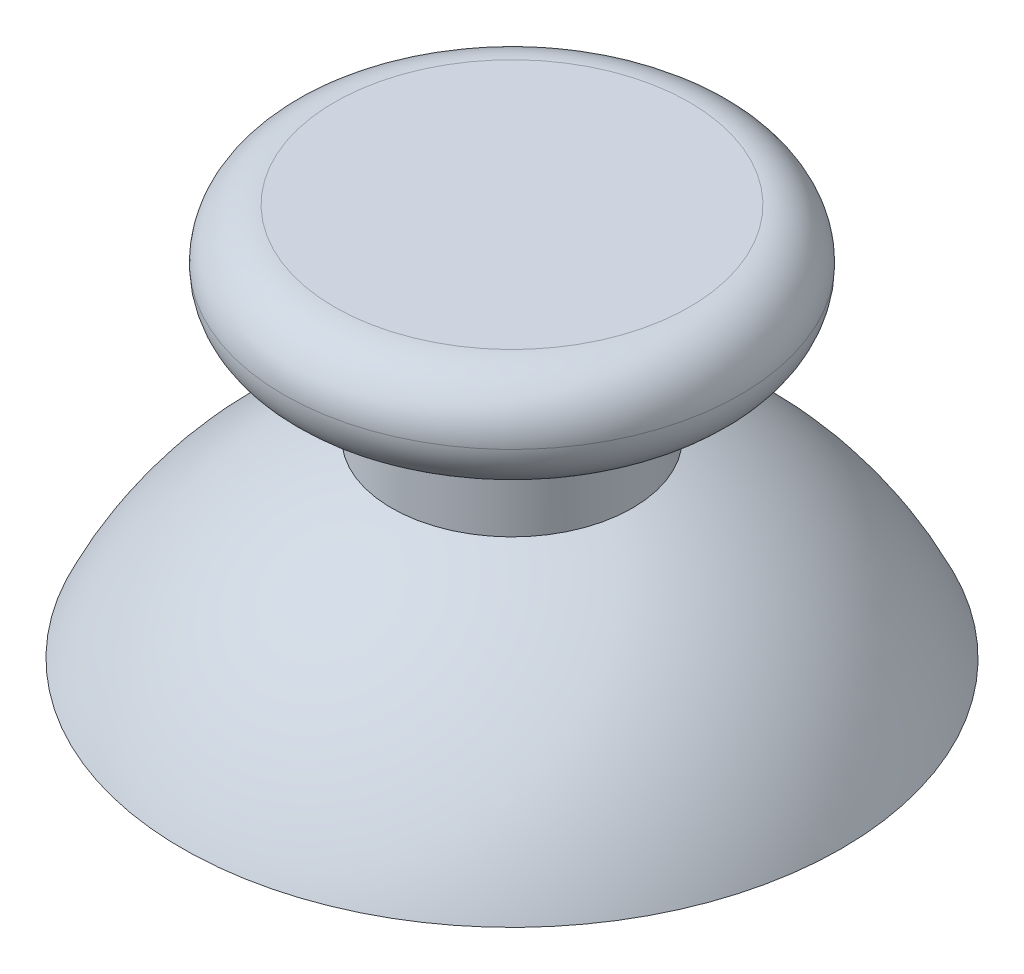
ISO-10303-21;
HEADER;
FILE_DESCRIPTION(('STEP AP214'),'2;1');
FILE_NAME('part.step','',(''),(''),'','','');
FILE_SCHEMA(('AUTOMOTIVE_DESIGN { 1 0 10303 214 1 1 1 1 }'));
ENDSEC;
DATA;
#1=APPLICATION_CONTEXT('core data for automotive mechanical design processes');
#2=APPLICATION_PROTOCOL_DEFINITION('international standard','automotive_design',2000,#1);
#3=PRODUCT_CONTEXT('',#1,'mechanical');
#4=PRODUCT('Part','Part','',(#3));
#5=PRODUCT_RELATED_PRODUCT_CATEGORY('part','',(#4));
#6=PRODUCT_DEFINITION_FORMATION('','',#4);
#7=PRODUCT_DEFINITION_CONTEXT('part definition',#1,'design');
#8=PRODUCT_DEFINITION('design','',#6,#7);
#9=PRODUCT_DEFINITION_SHAPE('','',#8);
#10=(LENGTH_UNIT() NAMED_UNIT(*) SI_UNIT(.MILLI.,.METRE.));
#11=(NAMED_UNIT(*) PLANE_ANGLE_UNIT() SI_UNIT($,.RADIAN.));
#12=(NAMED_UNIT(*) SI_UNIT($,.STERADIAN.) SOLID_ANGLE_UNIT());
#13=UNCERTAINTY_MEASURE_WITH_UNIT(LENGTH_MEASURE(1.E-05),#10,'distance_accuracy_value','');
#14=(GEOMETRIC_REPRESENTATION_CONTEXT(3) GLOBAL_UNCERTAINTY_ASSIGNED_CONTEXT((#13)) GLOBAL_UNIT_ASSIGNED_CONTEXT((#10,
#11,#12)) REPRESENTATION_CONTEXT('',''));
#15=CARTESIAN_POINT('',(0.,0.,0.));
#16=DIRECTION('',(0.,0.,1.));
#17=DIRECTION('',(1.,0.,0.));
#18=AXIS2_PLACEMENT_3D('',#15,#16,#17);
#19=CARTESIAN_POINT('',(0.,4.,0.));
#20=DIRECTION('',(0.,-1.,0.));
#21=DIRECTION('',(0.,0.,-1.));
#22=AXIS2_PLACEMENT_3D('',#19,#20,#21);
#23=CYLINDRICAL_SURFACE('',#22,4.75);
#24=CARTESIAN_POINT('',(0.,0.00694265924009937,0.));
#25=DIRECTION('',(0.,-1.,0.));
#26=DIRECTION('',(0.,0.,-1.));
#27=AXIS2_PLACEMENT_3D('',#24,#25,#26);
#28=CIRCLE('',#27,4.75);
#29=CARTESIAN_POINT('',(4.75,0.00694265924010111,0.));
#30=VERTEX_POINT('',#29);
#31=EDGE_CURVE('E55',#30,#30,#28,.F.);
#32=ORIENTED_EDGE('',*,*,#31,.T.);
#33=EDGE_LOOP('',(#32));
#34=FACE_BOUND('',#33,.T.);
#35=CARTESIAN_POINT('',(0.,4.,0.));
#36=DIRECTION('',(0.,1.,0.));
#37=DIRECTION('',(0.,0.,1.));
#38=AXIS2_PLACEMENT_3D('',#35,#36,#37);
#39=CIRCLE('',#38,4.75);
#40=CARTESIAN_POINT('',(0.,4.,4.75));
#41=VERTEX_POINT('',#40);
#42=EDGE_CURVE('E49',#41,#41,#39,.T.);
#43=ORIENTED_EDGE('',*,*,#42,.F.);
#44=EDGE_LOOP('',(#43));
#45=FACE_BOUND('',#44,.T.);
#46=ADVANCED_FACE('F32',(#34,#45),#23,.T.);
#47=CARTESIAN_POINT('',(0.,8.,0.));
#48=DIRECTION('',(0.,1.,0.));
#49=DIRECTION('',(0.,0.,1.));
#50=AXIS2_PLACEMENT_3D('',#47,#48,#49);
#51=PLANE('',#50);
#52=CARTESIAN_POINT('',(0.,8.,0.));
#53=DIRECTION('',(0.,1.,0.));
#54=DIRECTION('',(0.,0.,1.));
#55=AXIS2_PLACEMENT_3D('',#52,#53,#54);
#56=CIRCLE('',#55,7.);
#57=CARTESIAN_POINT('',(0.,8.,7.));
#58=VERTEX_POINT('',#57);
#59=EDGE_CURVE('E44',#58,#58,#56,.T.);
#60=ORIENTED_EDGE('',*,*,#59,.T.);
#61=EDGE_LOOP('',(#60));
#62=FACE_BOUND('',#61,.T.);
#63=ADVANCED_FACE('F77',(#62),#51,.T.);
#64=CARTESIAN_POINT('',(0.,4.,0.));
#65=DIRECTION('',(0.,1.,0.));
#66=DIRECTION('',(0.,0.,1.));
#67=AXIS2_PLACEMENT_3D('',#64,#65,#66);
#68=PLANE('',#67);
#69=CARTESIAN_POINT('',(0.,4.,0.));
#70=DIRECTION('',(0.,1.,0.));
#71=DIRECTION('',(0.,0.,1.));
#72=AXIS2_PLACEMENT_3D('',#69,#70,#71);
#73=CIRCLE('',#72,7.);
#74=CARTESIAN_POINT('',(0.,4.,7.));
#75=VERTEX_POINT('',#74);
#76=EDGE_CURVE('E40',#75,#75,#73,.F.);
#77=ORIENTED_EDGE('',*,*,#76,.T.);
#78=EDGE_LOOP('',(#77));
#79=FACE_BOUND('',#78,.T.);
#80=ORIENTED_EDGE('',*,*,#42,.T.);
#81=EDGE_LOOP('',(#80));
#82=FACE_BOUND('',#81,.T.);
#83=ADVANCED_FACE('F74',(#79,#82),#68,.F.);
#84=CARTESIAN_POINT('',(0.,6.,0.));
#85=DIRECTION('',(0.,1.,0.));
#86=DIRECTION('',(0.,0.,1.));
#87=AXIS2_PLACEMENT_3D('',#84,#85,#86);
#88=TOROIDAL_SURFACE('',#87,7.,2.);
#89=ORIENTED_EDGE('',*,*,#76,.F.);
#90=EDGE_LOOP('',(#89));
#91=FACE_BOUND('',#90,.T.);
#92=CARTESIAN_POINT('',(0.,6.,0.));
#93=DIRECTION('',(0.,1.,0.));
#94=DIRECTION('',(0.,0.,1.));
#95=AXIS2_PLACEMENT_3D('',#92,#93,#94);
#96=CIRCLE('',#95,9.);
#97=CARTESIAN_POINT('',(0.,6.,9.));
#98=VERTEX_POINT('',#97);
#99=EDGE_CURVE('E53',#98,#98,#96,.T.);
#100=ORIENTED_EDGE('',*,*,#99,.F.);
#101=EDGE_LOOP('',(#100));
#102=FACE_BOUND('',#101,.T.);
#103=ADVANCED_FACE('F34',(#91,#102),#88,.T.);
#104=CARTESIAN_POINT('',(0.,6.,0.));
#105=DIRECTION('',(0.,1.,0.));
#106=DIRECTION('',(0.,0.,1.));
#107=AXIS2_PLACEMENT_3D('',#104,#105,#106);
#108=TOROIDAL_SURFACE('',#107,7.,2.);
#109=ORIENTED_EDGE('',*,*,#99,.T.);
#110=EDGE_LOOP('',(#109));
#111=FACE_BOUND('',#110,.T.);
#112=ORIENTED_EDGE('',*,*,#59,.F.);
#113=EDGE_LOOP('',(#112));
#114=FACE_BOUND('',#113,.T.);
#115=ADVANCED_FACE('F85',(#111,#114),#108,.T.);
#116=CARTESIAN_POINT('',(0.,-13.5,0.));
#117=DIRECTION('',(0.,-1.,0.));
#118=DIRECTION('',(1.,0.,0.));
#119=AXIS2_PLACEMENT_3D('',#116,#117,#118);
#120=SPHERICAL_SURFACE('',#119,14.3178210632764);
#121=CARTESIAN_POINT('',(0.,-7.5,0.));
#122=DIRECTION('',(0.,-1.,0.));
#123=DIRECTION('',(0.,0.,-1.));
#124=AXIS2_PLACEMENT_3D('',#121,#122,#123);
#125=CIRCLE('',#124,13.);
#126=CARTESIAN_POINT('',(13.,-7.5,0.));
#127=VERTEX_POINT('',#126);
#128=EDGE_CURVE('E57',#127,#127,#125,.T.);
#129=CARTESIAN_POINT('',(13.,-7.5,0.));
#130=CARTESIAN_POINT('',(12.9499861839836,-7.39163593249533,0.));
#131=CARTESIAN_POINT('',(12.8986168451345,-7.2838975068988,0.));
#132=CARTESIAN_POINT('',(12.7932005645917,-7.06973866054883,0.));
#133=CARTESIAN_POINT('',(12.7391536228979,-6.96331823979541,0.));
#134=CARTESIAN_POINT('',(12.6284155794858,-6.75186212415852,0.));
#135=CARTESIAN_POINT('',(12.5717244777676,-6.64682642927507,0.));
#136=CARTESIAN_POINT('',(12.4557336592176,-6.43820539967056,0.));
#137=CARTESIAN_POINT('',(12.3964339423858,-6.33462006494951,0.));
#138=CARTESIAN_POINT('',(12.2752629495261,-6.12896454219563,0.));
#139=CARTESIAN_POINT('',(12.2133916734982,-6.02689435416279,0.));
#140=CARTESIAN_POINT('',(12.0871162584232,-5.82433294800363,0.));
#141=CARTESIAN_POINT('',(12.0227121193761,-5.7238417298773,0.));
#142=CARTESIAN_POINT('',(11.8914112496597,-5.52450110363583,0.));
#143=CARTESIAN_POINT('',(11.8245145189903,-5.42565169552068,0.));
#144=CARTESIAN_POINT('',(11.6882702984072,-5.22965650161063,0.));
#145=CARTESIAN_POINT('',(11.6189228084934,-5.13251071581572,0.));
#146=CARTESIAN_POINT('',(11.4778204336893,-4.93998351385043,0.));
#147=CARTESIAN_POINT('',(11.4060655487991,-4.84460209768006,0.));
#148=CARTESIAN_POINT('',(11.2601932538691,-4.65566327889016,0.));
#149=CARTESIAN_POINT('',(11.1860758438294,-4.56210587627063,0.));
#150=CARTESIAN_POINT('',(11.0355248457184,-4.37687358793774,0.));
#151=CARTESIAN_POINT('',(10.959091257647,-4.28519870222438,0.));
#152=CARTESIAN_POINT('',(10.8039556989557,-4.10378877387714,0.));
#153=CARTESIAN_POINT('',(10.7252537283356,-4.01405373124325,0.));
#154=CARTESIAN_POINT('',(10.5656306184925,-3.83657960220637,0.));
#155=CARTESIAN_POINT('',(10.4847094792694,-3.74884051580339,0.));
#156=CARTESIAN_POINT('',(10.320698633858,-3.57541316426723,0.));
#157=CARTESIAN_POINT('',(10.2376089276697,-3.48972489913407,0.));
#158=CARTESIAN_POINT('',(10.0693129060146,-3.32045277275623,0.));
#159=CARTESIAN_POINT('',(9.98410659054782,-3.23686891151156,0.));
#160=CARTESIAN_POINT('',(9.81163063158152,-3.07185785960272,0.));
#161=CARTESIAN_POINT('',(9.724360988082,-2.99043066893856,0.));
#162=CARTESIAN_POINT('',(9.54781294453699,-2.82978387627269,0.));
#163=CARTESIAN_POINT('',(9.45853454449149,-2.75056427427098,0.));
#164=CARTESIAN_POINT('',(9.27802481545774,-2.59438219656178,0.));
#165=CARTESIAN_POINT('',(9.18679348646947,-2.51741972085428,0.));
#166=CARTESIAN_POINT('',(9.00243494835963,-2.3658000219382,0.));
#167=CARTESIAN_POINT('',(8.90930773923805,-2.29114279872961,0.));
#168=CARTESIAN_POINT('',(8.72121567520355,-2.14418028949461,0.));
#169=CARTESIAN_POINT('',(8.62625082029062,-2.0718750034682,0.));
#170=CARTESIAN_POINT('',(8.43454284813268,-1.92966158256679,0.));
#171=CARTESIAN_POINT('',(8.33779973088767,-1.85975344769179,0.));
#172=CARTESIAN_POINT('',(8.14259572950881,-1.72237804407409,0.));
#173=CARTESIAN_POINT('',(8.04413484537497,-1.65491077533139,0.));
#174=CARTESIAN_POINT('',(7.8455568798151,-1.52245929263914,0.));
#175=CARTESIAN_POINT('',(7.74543979838909,-1.4574750786896,0.));
#176=CARTESIAN_POINT('',(7.54361204350017,-1.33003034152736,0.));
#177=CARTESIAN_POINT('',(7.44190137003726,-1.26756981831465,0.));
#178=CARTESIAN_POINT('',(7.23695003281783,-1.14521152050085,0.));
#179=CARTESIAN_POINT('',(7.13370936906131,-1.08531374589976,0.));
#180=CARTESIAN_POINT('',(6.92576260979774,-0.968118400472015,0.));
#181=CARTESIAN_POINT('',(6.82105651429071,-0.910820829645367,0.));
#182=CARTESIAN_POINT('',(6.61024436618822,-0.79886172161457,0.));
#183=CARTESIAN_POINT('',(6.50413831359278,-0.744200184410421,0.));
#184=CARTESIAN_POINT('',(6.29059260231296,-0.6375473226976,0.));
#185=CARTESIAN_POINT('',(6.18315294362858,-0.585555998188927,0.));
#186=CARTESIAN_POINT('',(5.9670072016841,-0.484276080194068,0.));
#187=CARTESIAN_POINT('',(5.85830111842398,-0.434987486707881,0.));
#188=CARTESIAN_POINT('',(5.63969051351607,-0.339143825451928,0.));
#189=CARTESIAN_POINT('',(5.52978599186828,-0.292588757682161,0.));
#190=CARTESIAN_POINT('',(5.30884719818328,-0.202241358472295,0.));
#191=CARTESIAN_POINT('',(5.19781292614608,-0.158449027032196,0.));
#192=CARTESIAN_POINT('',(4.97468420377368,-0.0736541160652312,0.));
#193=CARTESIAN_POINT('',(4.86258975343848,-0.0326515365383655,0.));
#194=CARTESIAN_POINT('',(4.75,0.00694265924010111,0.));
#195=B_SPLINE_CURVE_WITH_KNOTS('',3,(#129,#130,#131,#132,#133,#134,#135,#136,#137,#138,#139,
#140,#141,#142,#143,#144,#145,#146,#147,#148,#149,#150,#151,#152,#153,#154,#155,#156,#157,#158,
#159,#160,#161,#162,#163,#164,#165,#166,#167,#168,#169,#170,#171,#172,#173,#174,#175,#176,#177,
#178,#179,#180,#181,#182,#183,#184,#185,#186,#187,#188,#189,#190,#191,#192,#193,#194),
.UNSPECIFIED.,.F.,.F.,(4,2,2,2,2,2,2,2,2,2,2,2,2,2,2,2,2,2,2,2,2,2,2,2,2,2,2,2,2,2,2,2,4),(0.,
0.358037258179801,0.716074516359602,1.0741117745394,1.4321490327192,1.79018629089901,
2.1482235490788,2.50626080725861,2.86429806543841,3.22233532361821,3.58037258179801,
3.93840983997781,4.29644709815761,4.65448435633741,5.01252161451721,5.37055887269702,
5.72859613087682,6.08663338905662,6.44467064723642,6.80270790541622,7.16074516359602,
7.51878242177582,7.87681967995562,8.23485693813542,8.59289419631522,8.95093145449502,
9.30896871267482,9.66700597085462,10.0250432290344,10.3830804872142,10.741117745394,
11.0991550035738,11.4571922617536),.UNSPECIFIED.);
#196=EDGE_CURVE('BSEAM87',#127,#30,#195,.T.);
#197=ORIENTED_EDGE('',*,*,#128,.F.);
#198=ORIENTED_EDGE('',*,*,#31,.F.);
#199=ORIENTED_EDGE('',*,*,#196,.T.);
#200=ORIENTED_EDGE('',*,*,#196,.F.);
#201=EDGE_LOOP('',(#197,#199,#198,#200));
#202=FACE_BOUND('',#201,.T.);
#203=ADVANCED_FACE('F87',(#202),#120,.T.);
#204=CARTESIAN_POINT('',(13.,-7.5,0.));
#205=DIRECTION('',(0.,1.,0.));
#206=DIRECTION('',(0.,0.,1.));
#207=AXIS2_PLACEMENT_3D('',#204,#205,#206);
#208=PLANE('',#207);
#209=CARTESIAN_POINT('',(0.,-7.5,0.));
#210=DIRECTION('',(0.,1.,0.));
#211=DIRECTION('',(0.,0.,1.));
#212=AXIS2_PLACEMENT_3D('',#209,#210,#211);
#213=CIRCLE('',#212,11.8896744225167);
#214=CARTESIAN_POINT('',(11.8896744225167,-7.5,0.));
#215=VERTEX_POINT('',#214);
#216=EDGE_CURVE('E69',#215,#215,#213,.F.);
#217=ORIENTED_EDGE('',*,*,#216,.F.);
#218=EDGE_LOOP('',(#217));
#219=FACE_BOUND('',#218,.T.);
#220=ORIENTED_EDGE('',*,*,#128,.T.);
#221=EDGE_LOOP('',(#220));
#222=FACE_BOUND('',#221,.T.);
#223=ADVANCED_FACE('F93',(#219,#222),#208,.F.);
#224=CARTESIAN_POINT('',(0.,4.,0.));
#225=DIRECTION('',(0.,-1.,0.));
#226=DIRECTION('',(0.,0.,-1.));
#227=AXIS2_PLACEMENT_3D('',#224,#225,#226);
#228=CYLINDRICAL_SURFACE('',#227,3.75);
#229=CARTESIAN_POINT('',(0.,0.,0.));
#230=DIRECTION('',(0.,-1.,0.));
#231=DIRECTION('',(0.,0.,-1.));
#232=AXIS2_PLACEMENT_3D('',#229,#230,#231);
#233=CIRCLE('',#232,3.75);
#234=CARTESIAN_POINT('',(0.,0.,-3.75));
#235=VERTEX_POINT('',#234);
#236=EDGE_CURVE('E10',#235,#235,#233,.T.);
#237=ORIENTED_EDGE('',*,*,#236,.F.);
#238=EDGE_LOOP('',(#237));
#239=FACE_BOUND('',#238,.T.);
#240=CARTESIAN_POINT('',(0.,-0.721038466547946,0.));
#241=DIRECTION('',(0.,-1.,0.));
#242=DIRECTION('',(0.,0.,-1.));
#243=AXIS2_PLACEMENT_3D('',#240,#241,#242);
#244=CIRCLE('',#243,3.75);
#245=CARTESIAN_POINT('',(3.75,-0.721038466547945,0.));
#246=VERTEX_POINT('',#245);
#247=EDGE_CURVE('E237',#246,#246,#244,.F.);
#248=ORIENTED_EDGE('',*,*,#247,.F.);
#249=EDGE_LOOP('',(#248));
#250=FACE_BOUND('',#249,.T.);
#251=ADVANCED_FACE('F138',(#239,#250),#228,.F.);
#252=CARTESIAN_POINT('',(0.,-13.5,0.));
#253=DIRECTION('',(0.,-1.,0.));
#254=DIRECTION('',(1.,0.,0.));
#255=AXIS2_PLACEMENT_3D('',#252,#253,#254);
#256=SPHERICAL_SURFACE('',#255,13.3178210632764);
#257=CARTESIAN_POINT('',(11.8896744225167,-7.5,0.));
#258=CARTESIAN_POINT('',(11.8385493389406,-7.39868914500447,0.));
#259=CARTESIAN_POINT('',(11.7861287784775,-7.29803205576588,0.));
#260=CARTESIAN_POINT('',(11.6787322730639,-7.09809047237467,0.));
#261=CARTESIAN_POINT('',(11.6237563281134,-6.99880597822207,0.));
#262=CARTESIAN_POINT('',(11.5112846230115,-6.80167464857496,0.));
#263=CARTESIAN_POINT('',(11.4537888628602,-6.70382781308046,0.));
#264=CARTESIAN_POINT('',(11.336315190532,-6.50963568461611,0.));
#265=CARTESIAN_POINT('',(11.2763372783553,-6.41329039164626,0.));
#266=CARTESIAN_POINT('',(11.1539384671476,-6.22216431535911,0.));
#267=CARTESIAN_POINT('',(11.0915175681167,-6.12738353204181,0.));
#268=CARTESIAN_POINT('',(10.96427357678,-5.93944840265866,0.));
#269=CARTESIAN_POINT('',(10.8994504844742,-5.84629405659279,0.));
#270=CARTESIAN_POINT('',(10.7674444611903,-5.66167267119505,0.));
#271=CARTESIAN_POINT('',(10.7002615302122,-5.57020563186318,0.));
#272=CARTESIAN_POINT('',(10.5635797284481,-5.38901862566458,0.));
#273=CARTESIAN_POINT('',(10.4940808576622,-5.29929865879787,0.));
#274=CARTESIAN_POINT('',(10.3528125878001,-5.12166442202826,0.));
#275=CARTESIAN_POINT('',(10.2810431887241,-5.03375015212536,0.));
#276=CARTESIAN_POINT('',(10.1352807575637,-4.85978475382248,0.));
#277=CARTESIAN_POINT('',(10.0612877254795,-4.7737336254225,0.));
#278=CARTESIAN_POINT('',(9.91112637649705,-4.60355073728262,0.));
#279=CARTESIAN_POINT('',(9.83495805959883,-4.51941897754272,0.));
#280=CARTESIAN_POINT('',(9.68049591055954,-4.35312979972828,0.));
#281=CARTESIAN_POINT('',(9.60220207841848,-4.27097238165375,0.));
#282=CARTESIAN_POINT('',(9.44354005730635,-4.10868557011135,0.));
#283=CARTESIAN_POINT('',(9.36317186833529,-4.02855617664348,0.));
#284=CARTESIAN_POINT('',(9.20041364739402,-3.8703777721123,0.));
#285=CARTESIAN_POINT('',(9.11802361542381,-3.79232876104897,0.));
#286=CARTESIAN_POINT('',(8.95127554341871,-3.63836211977049,0.));
#287=CARTESIAN_POINT('',(8.86691750338381,-3.56244448955533,0.));
#288=CARTESIAN_POINT('',(8.69628853611106,-3.41279021573921,0.));
#289=CARTESIAN_POINT('',(8.61001760887321,-3.33905357213824,0.));
#290=CARTESIAN_POINT('',(8.43561923796666,-3.19380945222581,0.));
#291=CARTESIAN_POINT('',(8.34749179429796,-3.12230197591434,0.));
#292=CARTESIAN_POINT('',(8.1694379743787,-2.98156291468344,0.));
#293=CARTESIAN_POINT('',(8.07951159812812,-2.91233132976402,0.));
#294=CARTESIAN_POINT('',(7.89791867234473,-2.77618928831678,0.));
#295=CARTESIAN_POINT('',(7.80625212281191,-2.70927883178897,0.));
#296=CARTESIAN_POINT('',(7.62123874682007,-2.57782276746289,0.));
#297=CARTESIAN_POINT('',(7.52789192036106,-2.51327715966462,0.));
#298=CARTESIAN_POINT('',(7.33957898479203,-2.38659296790668,0.));
#299=CARTESIAN_POINT('',(7.24461287568202,-2.32445438394701,0.));
#300=CARTESIAN_POINT('',(7.05312342715108,-2.20262484218743,0.));
#301=CARTESIAN_POINT('',(6.95660008773014,-2.14293388438752,0.));
#302=CARTESIAN_POINT('',(6.76205924843493,-2.02603859795484,0.));
#303=CARTESIAN_POINT('',(6.66404174856066,-1.96883426932208,0.));
#304=CARTESIAN_POINT('',(6.46657663452829,-1.85694961941591,0.));
#305=CARTESIAN_POINT('',(6.3671290203702,-1.8022692981425,0.));
#306=CARTESIAN_POINT('',(6.1668686583833,-1.69546839196931,0.));
#307=CARTESIAN_POINT('',(6.06605591055451,-1.64334780706954,0.));
#308=CARTESIAN_POINT('',(5.86313115389653,-1.54170042990723,0.));
#309=CARTESIAN_POINT('',(5.76101914506734,-1.49217363764469,0.));
#310=CARTESIAN_POINT('',(5.55556258782169,-1.39574620786363,0.));
#311=CARTESIAN_POINT('',(5.45221803940522,-1.34884557034509,0.));
#312=CARTESIAN_POINT('',(5.24436393055983,-1.25770109369593,0.));
#313=CARTESIAN_POINT('',(5.13985437013091,-1.21345725456531,0.));
#314=CARTESIAN_POINT('',(4.92973852308274,-1.12765529164371,0.));
#315=CARTESIAN_POINT('',(4.8241322364635,-1.08609716785275,0.));
#316=CARTESIAN_POINT('',(4.61189195063281,-1.00569376296039,0.));
#317=CARTESIAN_POINT('',(4.50525795142137,-0.966848481859005,0.));
#318=CARTESIAN_POINT('',(4.29103188388575,-0.891896246634329,0.));
#319=CARTESIAN_POINT('',(4.18343981556156,-0.855789292511042,0.));
#320=CARTESIAN_POINT('',(3.96736803470788,-0.786336922769242,0.));
#321=CARTESIAN_POINT('',(3.8588883221784,-0.75299150715073,0.));
#322=CARTESIAN_POINT('',(3.75,-0.721038466547945,0.));
#323=B_SPLINE_CURVE_WITH_KNOTS('',3,(#257,#258,#259,#260,#261,#262,#263,#264,#265,#266,#267,
#268,#269,#270,#271,#272,#273,#274,#275,#276,#277,#278,#279,#280,#281,#282,#283,#284,#285,#286,
#287,#288,#289,#290,#291,#292,#293,#294,#295,#296,#297,#298,#299,#300,#301,#302,#303,#304,#305,
#306,#307,#308,#309,#310,#311,#312,#313,#314,#315,#316,#317,#318,#319,#320,#321,#322),
.UNSPECIFIED.,.F.,.F.,(4,2,2,2,2,2,2,2,2,2,2,2,2,2,2,2,2,2,2,2,2,2,2,2,2,2,2,2,2,2,2,2,4),(0.,
0.340430085801336,0.680860171602672,1.02129025740401,1.36172034320534,1.70215042900668,
2.04258051480801,2.38301060060935,2.72344068641068,3.06387077221202,3.40430085801336,
3.74473094381469,4.08516102961603,4.42559111541736,4.7660212012187,5.10645128702003,
5.44688137282137,5.7873114586227,6.12774154442404,6.46817163022537,6.80860171602671,
7.14903180182805,7.48946188762938,7.82989197343072,8.17032205923205,8.51075214503339,
8.85118223083472,9.19161231663606,9.5320424024374,9.87247248823873,10.2129025740401,
10.5533326598414,10.8937627456427),.UNSPECIFIED.);
#324=EDGE_CURVE('BSEAM148',#215,#246,#323,.T.);
#325=ORIENTED_EDGE('',*,*,#216,.T.);
#326=ORIENTED_EDGE('',*,*,#247,.T.);
#327=ORIENTED_EDGE('',*,*,#324,.T.);
#328=ORIENTED_EDGE('',*,*,#324,.F.);
#329=EDGE_LOOP('',(#325,#327,#326,#328));
#330=FACE_BOUND('',#329,.T.);
#331=ADVANCED_FACE('F148',(#330),#256,.F.);
#332=CARTESIAN_POINT('',(0.,0.,0.));
#333=DIRECTION('',(0.,-1.,0.));
#334=DIRECTION('',(0.,0.,-1.));
#335=AXIS2_PLACEMENT_3D('',#332,#333,#334);
#336=PLANE('',#335);
#337=ORIENTED_EDGE('',*,*,#236,.T.);
#338=EDGE_LOOP('',(#337));
#339=FACE_BOUND('',#338,.T.);
#340=ADVANCED_FACE('F196',(#339),#336,.T.);
#341=CLOSED_SHELL('',(#46,#63,#83,#103,#115,#203,#223,#251,#331,#340));
#342=CARTESIAN_POINT('',(0.,2.,0.));
#343=DIRECTION('',(0.,-1.,0.));
#344=DIRECTION('',(0.,0.,-1.));
#345=AXIS2_PLACEMENT_3D('',#342,#343,#344);
#346=PLANE('',#345);
#347=CARTESIAN_POINT('',(0.,2.,0.));
#348=DIRECTION('',(0.,-1.,0.));
#349=DIRECTION('',(0.,0.,-1.));
#350=AXIS2_PLACEMENT_3D('',#347,#348,#349);
#351=CIRCLE('',#350,3.75);
#352=CARTESIAN_POINT('',(0.,2.,-3.75));
#353=VERTEX_POINT('',#352);
#354=EDGE_CURVE('E233',#353,#353,#351,.T.);
#355=ORIENTED_EDGE('',*,*,#354,.F.);
#356=EDGE_LOOP('',(#355));
#357=FACE_BOUND('',#356,.T.);
#358=ADVANCED_FACE('F161',(#357),#346,.F.);
#359=CARTESIAN_POINT('',(0.,7.,0.));
#360=DIRECTION('',(0.,1.,0.));
#361=DIRECTION('',(0.,0.,1.));
#362=AXIS2_PLACEMENT_3D('',#359,#360,#361);
#363=PLANE('',#362);
#364=CARTESIAN_POINT('',(0.,7.,0.));
#365=DIRECTION('',(0.,1.,0.));
#366=DIRECTION('',(0.,0.,1.));
#367=AXIS2_PLACEMENT_3D('',#364,#365,#366);
#368=CIRCLE('',#367,7.);
#369=CARTESIAN_POINT('',(0.,7.,7.));
#370=VERTEX_POINT('',#369);
#371=EDGE_CURVE('E66',#370,#370,#368,.T.);
#372=ORIENTED_EDGE('',*,*,#371,.F.);
#373=EDGE_LOOP('',(#372));
#374=FACE_BOUND('',#373,.T.);
#375=ADVANCED_FACE('F155',(#374),#363,.F.);
#376=CARTESIAN_POINT('',(0.,6.,0.));
#377=DIRECTION('',(0.,1.,0.));
#378=DIRECTION('',(0.,0.,1.));
#379=AXIS2_PLACEMENT_3D('',#376,#377,#378);
#380=TOROIDAL_SURFACE('',#379,7.,1.);
#381=CARTESIAN_POINT('',(0.,6.,0.));
#382=DIRECTION('',(0.,1.,0.));
#383=DIRECTION('',(0.,0.,1.));
#384=AXIS2_PLACEMENT_3D('',#381,#382,#383);
#385=CIRCLE('',#384,8.);
#386=CARTESIAN_POINT('',(0.,6.,8.));
#387=VERTEX_POINT('',#386);
#388=EDGE_CURVE('E241',#387,#387,#385,.T.);
#389=ORIENTED_EDGE('',*,*,#388,.F.);
#390=EDGE_LOOP('',(#389));
#391=FACE_BOUND('',#390,.T.);
#392=ORIENTED_EDGE('',*,*,#371,.T.);
#393=EDGE_LOOP('',(#392));
#394=FACE_BOUND('',#393,.T.);
#395=ADVANCED_FACE('F160',(#391,#394),#380,.F.);
#396=CARTESIAN_POINT('',(0.,6.,0.));
#397=DIRECTION('',(0.,1.,0.));
#398=DIRECTION('',(0.,0.,1.));
#399=AXIS2_PLACEMENT_3D('',#396,#397,#398);
#400=TOROIDAL_SURFACE('',#399,7.,1.);
#401=CARTESIAN_POINT('',(0.,5.,0.));
#402=DIRECTION('',(0.,1.,0.));
#403=DIRECTION('',(0.,0.,1.));
#404=AXIS2_PLACEMENT_3D('',#401,#402,#403);
#405=CIRCLE('',#404,7.);
#406=CARTESIAN_POINT('',(0.,5.,7.));
#407=VERTEX_POINT('',#406);
#408=EDGE_CURVE('E61',#407,#407,#405,.F.);
#409=ORIENTED_EDGE('',*,*,#408,.T.);
#410=EDGE_LOOP('',(#409));
#411=FACE_BOUND('',#410,.T.);
#412=ORIENTED_EDGE('',*,*,#388,.T.);
#413=EDGE_LOOP('',(#412));
#414=FACE_BOUND('',#413,.T.);
#415=ADVANCED_FACE('F172',(#411,#414),#400,.F.);
#416=CARTESIAN_POINT('',(0.,5.,0.));
#417=DIRECTION('',(0.,1.,0.));
#418=DIRECTION('',(0.,0.,1.));
#419=AXIS2_PLACEMENT_3D('',#416,#417,#418);
#420=PLANE('',#419);
#421=ORIENTED_EDGE('',*,*,#408,.F.);
#422=EDGE_LOOP('',(#421));
#423=FACE_BOUND('',#422,.T.);
#424=CARTESIAN_POINT('',(0.,5.,0.));
#425=DIRECTION('',(0.,1.,0.));
#426=DIRECTION('',(0.,0.,1.));
#427=AXIS2_PLACEMENT_3D('',#424,#425,#426);
#428=CIRCLE('',#427,3.75);
#429=CARTESIAN_POINT('',(0.,5.,3.75));
#430=VERTEX_POINT('',#429);
#431=EDGE_CURVE('E242',#430,#430,#428,.T.);
#432=ORIENTED_EDGE('',*,*,#431,.F.);
#433=EDGE_LOOP('',(#432));
#434=FACE_BOUND('',#433,.T.);
#435=ADVANCED_FACE('F167',(#423,#434),#420,.T.);
#436=ORIENTED_EDGE('',*,*,#431,.T.);
#437=EDGE_LOOP('',(#436));
#438=FACE_BOUND('',#437,.T.);
#439=ORIENTED_EDGE('',*,*,#354,.T.);
#440=EDGE_LOOP('',(#439));
#441=FACE_BOUND('',#440,.T.);
#442=ADVANCED_FACE('F151',(#438,#441),#228,.F.);
#443=CLOSED_SHELL('',(#358,#375,#395,#415,#435,#442));
#444=ORIENTED_CLOSED_SHELL('',*,#443,.T.);
#445=BREP_WITH_VOIDS('B2',#341,(#444));
#446=ADVANCED_BREP_SHAPE_REPRESENTATION('',(#18,#445),#14);
#447=SHAPE_DEFINITION_REPRESENTATION(#9,#446);
ENDSEC;
END-ISO-10303-21;
